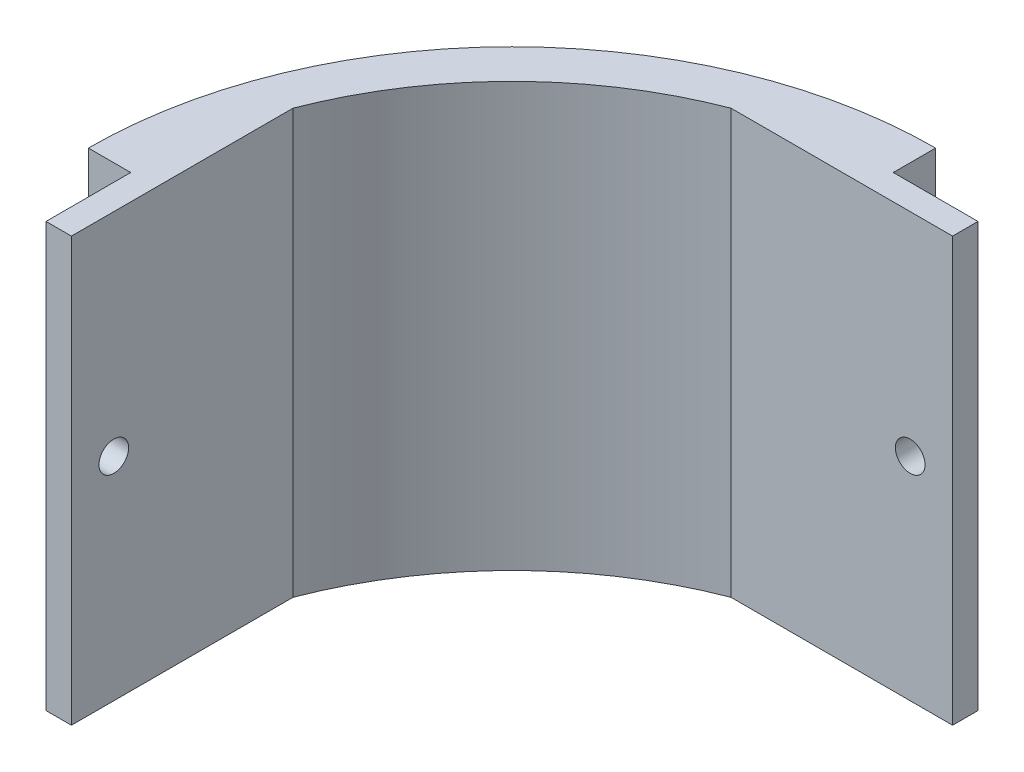
ISO-10303-21;
HEADER;
FILE_DESCRIPTION(('STEP AP214'),'2;1');
FILE_NAME('part.step','',(''),(''),'','','');
FILE_SCHEMA(('AUTOMOTIVE_DESIGN { 1 0 10303 214 1 1 1 1 }'));
ENDSEC;
DATA;
#1=APPLICATION_CONTEXT('core data for automotive mechanical design processes');
#2=APPLICATION_PROTOCOL_DEFINITION('international standard','automotive_design',2000,#1);
#3=PRODUCT_CONTEXT('',#1,'mechanical');
#4=PRODUCT('Part','Part','',(#3));
#5=PRODUCT_RELATED_PRODUCT_CATEGORY('part','',(#4));
#6=PRODUCT_DEFINITION_FORMATION('','',#4);
#7=PRODUCT_DEFINITION_CONTEXT('part definition',#1,'design');
#8=PRODUCT_DEFINITION('design','',#6,#7);
#9=PRODUCT_DEFINITION_SHAPE('','',#8);
#10=(LENGTH_UNIT() NAMED_UNIT(*) SI_UNIT(.MILLI.,.METRE.));
#11=(NAMED_UNIT(*) PLANE_ANGLE_UNIT() SI_UNIT($,.RADIAN.));
#12=(NAMED_UNIT(*) SI_UNIT($,.STERADIAN.) SOLID_ANGLE_UNIT());
#13=UNCERTAINTY_MEASURE_WITH_UNIT(LENGTH_MEASURE(1.E-05),#10,'distance_accuracy_value','');
#14=(GEOMETRIC_REPRESENTATION_CONTEXT(3) GLOBAL_UNCERTAINTY_ASSIGNED_CONTEXT((#13)) GLOBAL_UNIT_ASSIGNED_CONTEXT((#10,
#11,#12)) REPRESENTATION_CONTEXT('',''));
#15=CARTESIAN_POINT('',(0.,0.,0.));
#16=DIRECTION('',(0.,0.,1.));
#17=DIRECTION('',(1.,0.,0.));
#18=AXIS2_PLACEMENT_3D('',#15,#16,#17);
#19=CARTESIAN_POINT('',(0.,50.,0.));
#20=DIRECTION('',(0.,-1.,0.));
#21=DIRECTION('',(0.,0.,-1.));
#22=AXIS2_PLACEMENT_3D('',#19,#20,#21);
#23=CYLINDRICAL_SURFACE('',#22,45.);
#24=CARTESIAN_POINT('',(0.,0.,0.));
#25=DIRECTION('',(0.,-1.,0.));
#26=DIRECTION('',(0.,0.,1.));
#27=AXIS2_PLACEMENT_3D('',#24,#25,#26);
#28=CIRCLE('',#27,45.);
#29=CARTESIAN_POINT('',(-42.,0.,-16.1554944214035));
#30=VERTEX_POINT('',#29);
#31=CARTESIAN_POINT('',(-16.1554944214035,0.,-42.));
#32=VERTEX_POINT('',#31);
#33=EDGE_CURVE('E59',#30,#32,#28,.T.);
#34=ORIENTED_EDGE('',*,*,#33,.T.);
#35=DIRECTION('',(0.,-1.,0.));
#36=VECTOR('',#35,1.);
#37=CARTESIAN_POINT('',(-16.1554944214035,50.,-42.));
#38=LINE('',#37,#36);
#39=CARTESIAN_POINT('',(-16.1554944214035,50.,-42.));
#40=VERTEX_POINT('',#39);
#41=EDGE_CURVE('E54',#40,#32,#38,.T.);
#42=ORIENTED_EDGE('',*,*,#41,.F.);
#43=CARTESIAN_POINT('',(0.,50.,0.));
#44=DIRECTION('',(0.,-1.,0.));
#45=DIRECTION('',(0.,0.,1.));
#46=AXIS2_PLACEMENT_3D('',#43,#44,#45);
#47=CIRCLE('',#46,45.);
#48=CARTESIAN_POINT('',(-42.,50.,-16.1554944214035));
#49=VERTEX_POINT('',#48);
#50=EDGE_CURVE('E186',#49,#40,#47,.T.);
#51=ORIENTED_EDGE('',*,*,#50,.F.);
#52=DIRECTION('',(0.,-1.,0.));
#53=VECTOR('',#52,1.);
#54=CARTESIAN_POINT('',(-42.,50.,-16.1554944214035));
#55=LINE('',#54,#53);
#56=EDGE_CURVE('E182',#30,#49,#55,.F.);
#57=ORIENTED_EDGE('',*,*,#56,.F.);
#58=EDGE_LOOP('',(#34,#42,#51,#57));
#59=FACE_BOUND('',#58,.T.);
#60=ADVANCED_FACE('F39',(#59),#23,.F.);
#61=CARTESIAN_POINT('',(0.,50.,-50.));
#62=DIRECTION('',(-1.,0.,0.));
#63=DIRECTION('',(0.,0.,1.));
#64=AXIS2_PLACEMENT_3D('',#61,#62,#63);
#65=PLANE('',#64);
#66=DIRECTION('',(0.,0.,-1.));
#67=VECTOR('',#66,1.);
#68=CARTESIAN_POINT('',(0.,0.,-50.));
#69=LINE('',#68,#67);
#70=CARTESIAN_POINT('',(0.,0.,-45.));
#71=VERTEX_POINT('',#70);
#72=CARTESIAN_POINT('',(0.,0.,-50.));
#73=VERTEX_POINT('',#72);
#74=EDGE_CURVE('E202',#71,#73,#69,.T.);
#75=ORIENTED_EDGE('',*,*,#74,.T.);
#76=DIRECTION('',(0.,-1.,0.));
#77=VECTOR('',#76,1.);
#78=CARTESIAN_POINT('',(0.,50.,-50.));
#79=LINE('',#78,#77);
#80=CARTESIAN_POINT('',(0.,50.,-50.));
#81=VERTEX_POINT('',#80);
#82=EDGE_CURVE('E47',#81,#73,#79,.T.);
#83=ORIENTED_EDGE('',*,*,#82,.F.);
#84=DIRECTION('',(0.,0.,-1.));
#85=VECTOR('',#84,1.);
#86=CARTESIAN_POINT('',(0.,50.,-50.));
#87=LINE('',#86,#85);
#88=CARTESIAN_POINT('',(0.,50.,-45.));
#89=VERTEX_POINT('',#88);
#90=EDGE_CURVE('E189',#89,#81,#87,.T.);
#91=ORIENTED_EDGE('',*,*,#90,.F.);
#92=DIRECTION('',(0.,-1.,0.));
#93=VECTOR('',#92,1.);
#94=CARTESIAN_POINT('',(0.,50.,-45.));
#95=LINE('',#94,#93);
#96=EDGE_CURVE('E11',#89,#71,#95,.T.);
#97=ORIENTED_EDGE('',*,*,#96,.T.);
#98=EDGE_LOOP('',(#75,#83,#91,#97));
#99=FACE_BOUND('',#98,.T.);
#100=ADVANCED_FACE('F237',(#99),#65,.F.);
#101=CARTESIAN_POINT('',(0.,50.,0.));
#102=DIRECTION('',(0.,-1.,0.));
#103=DIRECTION('',(0.,0.,-1.));
#104=AXIS2_PLACEMENT_3D('',#101,#102,#103);
#105=CYLINDRICAL_SURFACE('',#104,50.);
#106=CARTESIAN_POINT('',(0.,0.,0.));
#107=DIRECTION('',(0.,1.,0.));
#108=DIRECTION('',(0.,0.,1.));
#109=AXIS2_PLACEMENT_3D('',#106,#107,#108);
#110=CIRCLE('',#109,50.);
#111=CARTESIAN_POINT('',(-50.,0.,0.));
#112=VERTEX_POINT('',#111);
#113=EDGE_CURVE('E205',#73,#112,#110,.T.);
#114=ORIENTED_EDGE('',*,*,#113,.T.);
#115=DIRECTION('',(0.,-1.,0.));
#116=VECTOR('',#115,1.);
#117=CARTESIAN_POINT('',(-50.,50.,0.));
#118=LINE('',#117,#116);
#119=CARTESIAN_POINT('',(-50.,50.,0.));
#120=VERTEX_POINT('',#119);
#121=EDGE_CURVE('E213',#120,#112,#118,.T.);
#122=ORIENTED_EDGE('',*,*,#121,.F.);
#123=CARTESIAN_POINT('',(0.,50.,0.));
#124=DIRECTION('',(0.,1.,0.));
#125=DIRECTION('',(0.,0.,1.));
#126=AXIS2_PLACEMENT_3D('',#123,#124,#125);
#127=CIRCLE('',#126,50.);
#128=EDGE_CURVE('E193',#81,#120,#127,.T.);
#129=ORIENTED_EDGE('',*,*,#128,.F.);
#130=ORIENTED_EDGE('',*,*,#82,.T.);
#131=EDGE_LOOP('',(#114,#122,#129,#130));
#132=FACE_BOUND('',#131,.T.);
#133=ADVANCED_FACE('F222',(#132),#105,.T.);
#134=CARTESIAN_POINT('',(-50.,50.,0.));
#135=DIRECTION('',(0.,0.,-1.));
#136=DIRECTION('',(-1.,0.,0.));
#137=AXIS2_PLACEMENT_3D('',#134,#135,#136);
#138=PLANE('',#137);
#139=DIRECTION('',(1.,0.,0.));
#140=VECTOR('',#139,1.);
#141=CARTESIAN_POINT('',(-50.,0.,0.));
#142=LINE('',#141,#140);
#143=CARTESIAN_POINT('',(-45.,0.,0.));
#144=VERTEX_POINT('',#143);
#145=EDGE_CURVE('E190',#112,#144,#142,.T.);
#146=ORIENTED_EDGE('',*,*,#145,.T.);
#147=DIRECTION('',(0.,-1.,0.));
#148=VECTOR('',#147,1.);
#149=CARTESIAN_POINT('',(-45.,50.,0.));
#150=LINE('',#149,#148);
#151=CARTESIAN_POINT('',(-45.,50.,0.));
#152=VERTEX_POINT('',#151);
#153=EDGE_CURVE('E199',#152,#144,#150,.T.);
#154=ORIENTED_EDGE('',*,*,#153,.F.);
#155=DIRECTION('',(1.,0.,0.));
#156=VECTOR('',#155,1.);
#157=CARTESIAN_POINT('',(-50.,50.,0.));
#158=LINE('',#157,#156);
#159=EDGE_CURVE('E196',#120,#152,#158,.T.);
#160=ORIENTED_EDGE('',*,*,#159,.F.);
#161=ORIENTED_EDGE('',*,*,#121,.T.);
#162=EDGE_LOOP('',(#146,#154,#160,#161));
#163=FACE_BOUND('',#162,.T.);
#164=ADVANCED_FACE('F232',(#163),#138,.F.);
#165=CARTESIAN_POINT('',(0.,50.,0.));
#166=DIRECTION('',(0.,1.,0.));
#167=DIRECTION('',(0.,0.,1.));
#168=AXIS2_PLACEMENT_3D('',#165,#166,#167);
#169=PLANE('',#168);
#170=ORIENTED_EDGE('',*,*,#159,.T.);
#171=DIRECTION('',(0.,0.,-1.));
#172=VECTOR('',#171,1.);
#173=CARTESIAN_POINT('',(-45.,50.,10.));
#174=LINE('',#173,#172);
#175=CARTESIAN_POINT('',(-45.,50.,10.));
#176=VERTEX_POINT('',#175);
#177=EDGE_CURVE('E168',#176,#152,#174,.T.);
#178=ORIENTED_EDGE('',*,*,#177,.F.);
#179=DIRECTION('',(-1.,0.,0.));
#180=VECTOR('',#179,1.);
#181=CARTESIAN_POINT('',(-45.,50.,10.));
#182=LINE('',#181,#180);
#183=CARTESIAN_POINT('',(-42.,50.,10.));
#184=VERTEX_POINT('',#183);
#185=EDGE_CURVE('E165',#184,#176,#182,.T.);
#186=ORIENTED_EDGE('',*,*,#185,.F.);
#187=DIRECTION('',(0.,0.,1.));
#188=VECTOR('',#187,1.);
#189=CARTESIAN_POINT('',(-42.,50.,-50.002));
#190=LINE('',#189,#188);
#191=EDGE_CURVE('E176',#49,#184,#190,.T.);
#192=ORIENTED_EDGE('',*,*,#191,.F.);
#193=ORIENTED_EDGE('',*,*,#50,.T.);
#194=DIRECTION('',(1.,0.,0.));
#195=VECTOR('',#194,1.);
#196=CARTESIAN_POINT('',(-50.002,50.,-42.));
#197=LINE('',#196,#195);
#198=CARTESIAN_POINT('',(9.99999999999999,50.,-42.));
#199=VERTEX_POINT('',#198);
#200=EDGE_CURVE('E120',#40,#199,#197,.T.);
#201=ORIENTED_EDGE('',*,*,#200,.T.);
#202=DIRECTION('',(0.,0.,1.));
#203=VECTOR('',#202,1.);
#204=CARTESIAN_POINT('',(9.99999999999999,50.,-45.));
#205=LINE('',#204,#203);
#206=CARTESIAN_POINT('',(9.99999999999999,50.,-45.));
#207=VERTEX_POINT('',#206);
#208=EDGE_CURVE('E113',#207,#199,#205,.T.);
#209=ORIENTED_EDGE('',*,*,#208,.F.);
#210=DIRECTION('',(-1.,0.,0.));
#211=VECTOR('',#210,1.);
#212=CARTESIAN_POINT('',(9.99999999999999,50.,-45.));
#213=LINE('',#212,#211);
#214=EDGE_CURVE('E117',#207,#89,#213,.T.);
#215=ORIENTED_EDGE('',*,*,#214,.T.);
#216=ORIENTED_EDGE('',*,*,#90,.T.);
#217=ORIENTED_EDGE('',*,*,#128,.T.);
#218=EDGE_LOOP('',(#170,#178,#186,#192,#193,#201,#209,#215,#216,#217));
#219=FACE_BOUND('',#218,.T.);
#220=ADVANCED_FACE('F115',(#219),#169,.T.);
#221=CARTESIAN_POINT('',(0.,0.,0.));
#222=DIRECTION('',(0.,1.,0.));
#223=DIRECTION('',(0.,0.,1.));
#224=AXIS2_PLACEMENT_3D('',#221,#222,#223);
#225=PLANE('',#224);
#226=ORIENTED_EDGE('',*,*,#33,.F.);
#227=DIRECTION('',(0.,0.,1.));
#228=VECTOR('',#227,1.);
#229=CARTESIAN_POINT('',(-42.,0.,-50.002));
#230=LINE('',#229,#228);
#231=CARTESIAN_POINT('',(-42.,0.,10.));
#232=VERTEX_POINT('',#231);
#233=EDGE_CURVE('E179',#30,#232,#230,.T.);
#234=ORIENTED_EDGE('',*,*,#233,.T.);
#235=DIRECTION('',(1.,0.,0.));
#236=VECTOR('',#235,1.);
#237=CARTESIAN_POINT('',(-45.,0.,10.));
#238=LINE('',#237,#236);
#239=CARTESIAN_POINT('',(-45.,0.,10.));
#240=VERTEX_POINT('',#239);
#241=EDGE_CURVE('E157',#240,#232,#238,.T.);
#242=ORIENTED_EDGE('',*,*,#241,.F.);
#243=DIRECTION('',(0.,0.,-1.));
#244=VECTOR('',#243,1.);
#245=CARTESIAN_POINT('',(-45.,0.,10.));
#246=LINE('',#245,#244);
#247=EDGE_CURVE('E172',#240,#144,#246,.T.);
#248=ORIENTED_EDGE('',*,*,#247,.T.);
#249=ORIENTED_EDGE('',*,*,#145,.F.);
#250=ORIENTED_EDGE('',*,*,#113,.F.);
#251=ORIENTED_EDGE('',*,*,#74,.F.);
#252=DIRECTION('',(-1.,0.,0.));
#253=VECTOR('',#252,1.);
#254=CARTESIAN_POINT('',(9.99999999999999,0.,-45.));
#255=LINE('',#254,#253);
#256=CARTESIAN_POINT('',(9.99999999999999,0.,-45.));
#257=VERTEX_POINT('',#256);
#258=EDGE_CURVE('E141',#257,#71,#255,.T.);
#259=ORIENTED_EDGE('',*,*,#258,.F.);
#260=DIRECTION('',(0.,0.,-1.));
#261=VECTOR('',#260,1.);
#262=CARTESIAN_POINT('',(9.99999999999999,0.,-45.));
#263=LINE('',#262,#261);
#264=CARTESIAN_POINT('',(9.99999999999999,0.,-42.));
#265=VERTEX_POINT('',#264);
#266=EDGE_CURVE('E131',#265,#257,#263,.T.);
#267=ORIENTED_EDGE('',*,*,#266,.F.);
#268=DIRECTION('',(1.,0.,0.));
#269=VECTOR('',#268,1.);
#270=CARTESIAN_POINT('',(-50.002,0.,-42.));
#271=LINE('',#270,#269);
#272=EDGE_CURVE('E140',#32,#265,#271,.T.);
#273=ORIENTED_EDGE('',*,*,#272,.F.);
#274=EDGE_LOOP('',(#226,#234,#242,#248,#249,#250,#251,#259,#267,#273));
#275=FACE_BOUND('',#274,.T.);
#276=ADVANCED_FACE('F228',(#275),#225,.F.);
#277=CARTESIAN_POINT('',(-42.,0.,-50.002));
#278=DIRECTION('',(1.,0.,0.));
#279=DIRECTION('',(0.,0.,-1.));
#280=AXIS2_PLACEMENT_3D('',#277,#278,#279);
#281=PLANE('',#280);
#282=CARTESIAN_POINT('',(-42.,25.,5.));
#283=DIRECTION('',(1.,0.,0.));
#284=DIRECTION('',(0.,0.,-1.));
#285=AXIS2_PLACEMENT_3D('',#282,#283,#284);
#286=CIRCLE('',#285,1.75);
#287=CARTESIAN_POINT('',(-42.,25.,3.25));
#288=VERTEX_POINT('',#287);
#289=EDGE_CURVE('E284',#288,#288,#286,.T.);
#290=ORIENTED_EDGE('',*,*,#289,.F.);
#291=EDGE_LOOP('',(#290));
#292=FACE_BOUND('',#291,.T.);
#293=ORIENTED_EDGE('',*,*,#233,.F.);
#294=ORIENTED_EDGE('',*,*,#56,.T.);
#295=ORIENTED_EDGE('',*,*,#191,.T.);
#296=DIRECTION('',(0.,1.,0.));
#297=VECTOR('',#296,1.);
#298=CARTESIAN_POINT('',(-42.,0.,10.));
#299=LINE('',#298,#297);
#300=EDGE_CURVE('E161',#232,#184,#299,.T.);
#301=ORIENTED_EDGE('',*,*,#300,.F.);
#302=EDGE_LOOP('',(#293,#294,#295,#301));
#303=FACE_BOUND('',#302,.T.);
#304=ADVANCED_FACE('F249',(#292,#303),#281,.T.);
#305=CARTESIAN_POINT('',(-45.,0.,10.));
#306=DIRECTION('',(1.,0.,0.));
#307=DIRECTION('',(0.,0.,-1.));
#308=AXIS2_PLACEMENT_3D('',#305,#306,#307);
#309=PLANE('',#308);
#310=CARTESIAN_POINT('',(-45.,25.,5.));
#311=DIRECTION('',(-1.,0.,0.));
#312=DIRECTION('',(0.,0.,1.));
#313=AXIS2_PLACEMENT_3D('',#310,#311,#312);
#314=CIRCLE('',#313,1.75);
#315=CARTESIAN_POINT('',(-45.,25.,6.75));
#316=VERTEX_POINT('',#315);
#317=EDGE_CURVE('E287',#316,#316,#314,.T.);
#318=ORIENTED_EDGE('',*,*,#317,.F.);
#319=EDGE_LOOP('',(#318));
#320=FACE_BOUND('',#319,.T.);
#321=ORIENTED_EDGE('',*,*,#153,.T.);
#322=ORIENTED_EDGE('',*,*,#247,.F.);
#323=DIRECTION('',(0.,-1.,0.));
#324=VECTOR('',#323,1.);
#325=CARTESIAN_POINT('',(-45.,0.,10.));
#326=LINE('',#325,#324);
#327=EDGE_CURVE('E153',#176,#240,#326,.T.);
#328=ORIENTED_EDGE('',*,*,#327,.F.);
#329=ORIENTED_EDGE('',*,*,#177,.T.);
#330=EDGE_LOOP('',(#321,#322,#328,#329));
#331=FACE_BOUND('',#330,.T.);
#332=ADVANCED_FACE('F254',(#320,#331),#309,.F.);
#333=CARTESIAN_POINT('',(0.,0.,10.));
#334=DIRECTION('',(0.,0.,-1.));
#335=DIRECTION('',(-1.,0.,0.));
#336=AXIS2_PLACEMENT_3D('',#333,#334,#335);
#337=PLANE('',#336);
#338=ORIENTED_EDGE('',*,*,#327,.T.);
#339=ORIENTED_EDGE('',*,*,#241,.T.);
#340=ORIENTED_EDGE('',*,*,#300,.T.);
#341=ORIENTED_EDGE('',*,*,#185,.T.);
#342=EDGE_LOOP('',(#338,#339,#340,#341));
#343=FACE_BOUND('',#342,.T.);
#344=ADVANCED_FACE('F258',(#343),#337,.F.);
#345=CARTESIAN_POINT('',(-50.002,50.,-42.));
#346=DIRECTION('',(0.,0.,1.));
#347=DIRECTION('',(0.,-1.,0.));
#348=AXIS2_PLACEMENT_3D('',#345,#346,#347);
#349=PLANE('',#348);
#350=CARTESIAN_POINT('',(4.99999999999999,25.,-42.));
#351=DIRECTION('',(0.,0.,1.));
#352=DIRECTION('',(0.,-1.,0.));
#353=AXIS2_PLACEMENT_3D('',#350,#351,#352);
#354=CIRCLE('',#353,1.75);
#355=CARTESIAN_POINT('',(4.99999999999999,23.25,-42.));
#356=VERTEX_POINT('',#355);
#357=EDGE_CURVE('E136',#356,#356,#354,.T.);
#358=ORIENTED_EDGE('',*,*,#357,.F.);
#359=EDGE_LOOP('',(#358));
#360=FACE_BOUND('',#359,.T.);
#361=ORIENTED_EDGE('',*,*,#200,.F.);
#362=ORIENTED_EDGE('',*,*,#41,.T.);
#363=ORIENTED_EDGE('',*,*,#272,.T.);
#364=DIRECTION('',(0.,-1.,0.));
#365=VECTOR('',#364,1.);
#366=CARTESIAN_POINT('',(9.99999999999999,50.,-42.));
#367=LINE('',#366,#365);
#368=EDGE_CURVE('E125',#199,#265,#367,.T.);
#369=ORIENTED_EDGE('',*,*,#368,.F.);
#370=EDGE_LOOP('',(#361,#362,#363,#369));
#371=FACE_BOUND('',#370,.T.);
#372=ADVANCED_FACE('F262',(#360,#371),#349,.T.);
#373=CARTESIAN_POINT('',(9.99999999999999,50.,-45.));
#374=DIRECTION('',(0.,0.,1.));
#375=DIRECTION('',(1.,0.,0.));
#376=AXIS2_PLACEMENT_3D('',#373,#374,#375);
#377=PLANE('',#376);
#378=CARTESIAN_POINT('',(4.99999999999999,25.,-45.));
#379=DIRECTION('',(0.,0.,-1.));
#380=DIRECTION('',(-1.,0.,0.));
#381=AXIS2_PLACEMENT_3D('',#378,#379,#380);
#382=CIRCLE('',#381,1.75);
#383=CARTESIAN_POINT('',(3.24999999999999,25.,-45.));
#384=VERTEX_POINT('',#383);
#385=EDGE_CURVE('E291',#384,#384,#382,.T.);
#386=ORIENTED_EDGE('',*,*,#385,.F.);
#387=EDGE_LOOP('',(#386));
#388=FACE_BOUND('',#387,.T.);
#389=ORIENTED_EDGE('',*,*,#96,.F.);
#390=ORIENTED_EDGE('',*,*,#214,.F.);
#391=DIRECTION('',(0.,1.,0.));
#392=VECTOR('',#391,1.);
#393=CARTESIAN_POINT('',(9.99999999999999,50.,-45.));
#394=LINE('',#393,#392);
#395=EDGE_CURVE('E126',#257,#207,#394,.T.);
#396=ORIENTED_EDGE('',*,*,#395,.F.);
#397=ORIENTED_EDGE('',*,*,#258,.T.);
#398=EDGE_LOOP('',(#389,#390,#396,#397));
#399=FACE_BOUND('',#398,.T.);
#400=ADVANCED_FACE('F138',(#388,#399),#377,.F.);
#401=CARTESIAN_POINT('',(10.,0.,0.));
#402=DIRECTION('',(-1.,0.,0.));
#403=DIRECTION('',(0.,0.,1.));
#404=AXIS2_PLACEMENT_3D('',#401,#402,#403);
#405=PLANE('',#404);
#406=ORIENTED_EDGE('',*,*,#395,.T.);
#407=ORIENTED_EDGE('',*,*,#208,.T.);
#408=ORIENTED_EDGE('',*,*,#368,.T.);
#409=ORIENTED_EDGE('',*,*,#266,.T.);
#410=EDGE_LOOP('',(#406,#407,#408,#409));
#411=FACE_BOUND('',#410,.T.);
#412=ADVANCED_FACE('F129',(#411),#405,.F.);
#413=CARTESIAN_POINT('',(5.,25.,-35.));
#414=DIRECTION('',(0.,0.,-1.));
#415=DIRECTION('',(-1.,0.,0.));
#416=AXIS2_PLACEMENT_3D('',#413,#414,#415);
#417=CYLINDRICAL_SURFACE('',#416,1.75);
#418=ORIENTED_EDGE('',*,*,#357,.T.);
#419=EDGE_LOOP('',(#418));
#420=FACE_BOUND('',#419,.T.);
#421=ORIENTED_EDGE('',*,*,#385,.T.);
#422=EDGE_LOOP('',(#421));
#423=FACE_BOUND('',#422,.T.);
#424=ADVANCED_FACE('F272',(#420,#423),#417,.F.);
#425=CARTESIAN_POINT('',(-35.,25.,5.));
#426=DIRECTION('',(-1.,0.,0.));
#427=DIRECTION('',(0.,0.,1.));
#428=AXIS2_PLACEMENT_3D('',#425,#426,#427);
#429=CYLINDRICAL_SURFACE('',#428,1.75);
#430=ORIENTED_EDGE('',*,*,#289,.T.);
#431=EDGE_LOOP('',(#430));
#432=FACE_BOUND('',#431,.T.);
#433=ORIENTED_EDGE('',*,*,#317,.T.);
#434=EDGE_LOOP('',(#433));
#435=FACE_BOUND('',#434,.T.);
#436=ADVANCED_FACE('F275',(#432,#435),#429,.F.);
#437=CLOSED_SHELL('',(#60,#100,#133,#164,#220,#276,#304,#332,#344,#372,#400,#412,#424,#436));
#438=MANIFOLD_SOLID_BREP('B2',#437);
#439=ADVANCED_BREP_SHAPE_REPRESENTATION('',(#18,#438),#14);
#440=SHAPE_DEFINITION_REPRESENTATION(#9,#439);
ENDSEC;
END-ISO-10303-21;
